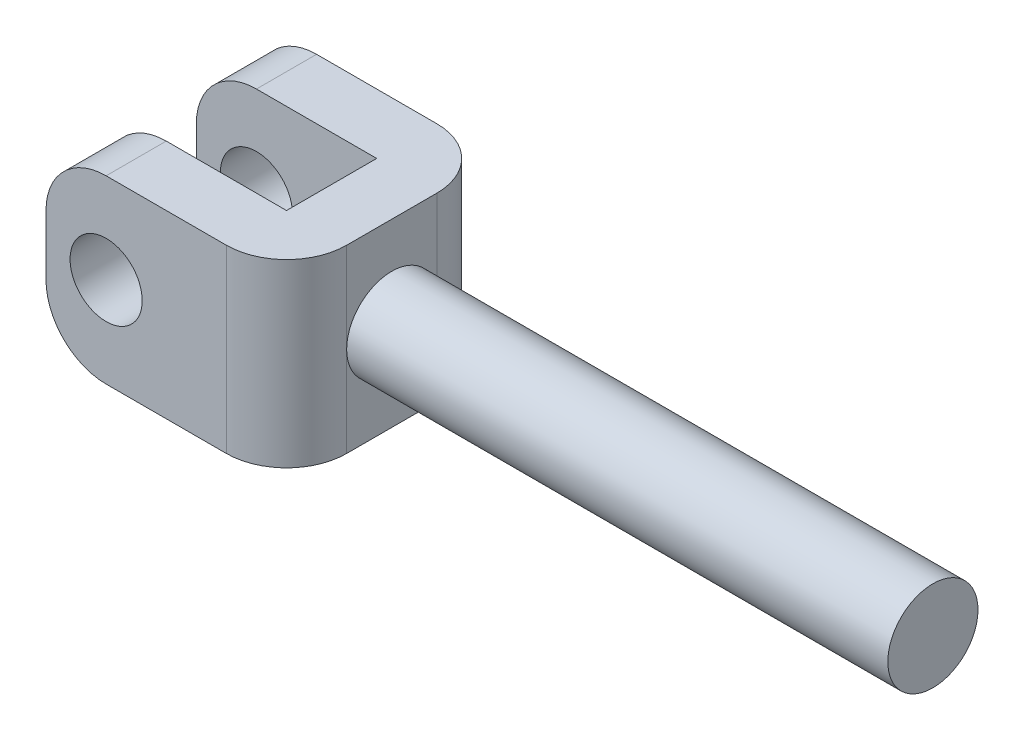
ISO-10303-21;
HEADER;
FILE_DESCRIPTION(('STEP AP214'),'2;1');
FILE_NAME('part.step','',(''),(''),'','','');
FILE_SCHEMA(('AUTOMOTIVE_DESIGN { 1 0 10303 214 1 1 1 1 }'));
ENDSEC;
DATA;
#1=APPLICATION_CONTEXT('core data for automotive mechanical design processes');
#2=APPLICATION_PROTOCOL_DEFINITION('international standard','automotive_design',2000,#1);
#3=PRODUCT_CONTEXT('',#1,'mechanical');
#4=PRODUCT('Part','Part','',(#3));
#5=PRODUCT_RELATED_PRODUCT_CATEGORY('part','',(#4));
#6=PRODUCT_DEFINITION_FORMATION('','',#4);
#7=PRODUCT_DEFINITION_CONTEXT('part definition',#1,'design');
#8=PRODUCT_DEFINITION('design','',#6,#7);
#9=PRODUCT_DEFINITION_SHAPE('','',#8);
#10=(LENGTH_UNIT() NAMED_UNIT(*) SI_UNIT(.MILLI.,.METRE.));
#11=(NAMED_UNIT(*) PLANE_ANGLE_UNIT() SI_UNIT($,.RADIAN.));
#12=(NAMED_UNIT(*) SI_UNIT($,.STERADIAN.) SOLID_ANGLE_UNIT());
#13=UNCERTAINTY_MEASURE_WITH_UNIT(LENGTH_MEASURE(1.E-05),#10,'distance_accuracy_value','');
#14=(GEOMETRIC_REPRESENTATION_CONTEXT(3) GLOBAL_UNCERTAINTY_ASSIGNED_CONTEXT((#13)) GLOBAL_UNIT_ASSIGNED_CONTEXT((#10,
#11,#12)) REPRESENTATION_CONTEXT('',''));
#15=CARTESIAN_POINT('',(0.,0.,0.));
#16=DIRECTION('',(0.,0.,1.));
#17=DIRECTION('',(1.,0.,0.));
#18=AXIS2_PLACEMENT_3D('',#15,#16,#17);
#19=CARTESIAN_POINT('',(1.,-1.5,-1.75));
#20=DIRECTION('',(1.,0.,0.));
#21=DIRECTION('',(0.,0.,-1.));
#22=AXIS2_PLACEMENT_3D('',#19,#20,#21);
#23=PLANE('',#22);
#24=DIRECTION('',(0.,0.,-1.));
#25=VECTOR('',#24,1.);
#26=CARTESIAN_POINT('',(1.,-1.5,-1.75));
#27=LINE('',#26,#25);
#28=CARTESIAN_POINT('',(1.,-1.5,0.75));
#29=VERTEX_POINT('',#28);
#30=CARTESIAN_POINT('',(1.,-1.5,-0.75));
#31=VERTEX_POINT('',#30);
#32=EDGE_CURVE('E210',#29,#31,#27,.T.);
#33=ORIENTED_EDGE('',*,*,#32,.T.);
#34=DIRECTION('',(0.,1.,0.));
#35=VECTOR('',#34,1.);
#36=CARTESIAN_POINT('',(1.,-1.5,-0.75));
#37=LINE('',#36,#35);
#38=CARTESIAN_POINT('',(0.999999999999999,0.,-0.75));
#39=VERTEX_POINT('',#38);
#40=EDGE_CURVE('E11',#31,#39,#37,.T.);
#41=ORIENTED_EDGE('',*,*,#40,.T.);
#42=CARTESIAN_POINT('',(0.999999999999999,0.,0.));
#43=DIRECTION('',(1.,0.,0.));
#44=DIRECTION('',(0.,0.,-1.));
#45=AXIS2_PLACEMENT_3D('',#42,#43,#44);
#46=CIRCLE('',#45,0.75);
#47=CARTESIAN_POINT('',(0.999999999999999,0.,0.75));
#48=VERTEX_POINT('',#47);
#49=EDGE_CURVE('E221',#48,#39,#46,.T.);
#50=ORIENTED_EDGE('',*,*,#49,.F.);
#51=DIRECTION('',(0.,1.,0.));
#52=VECTOR('',#51,1.);
#53=CARTESIAN_POINT('',(1.,-1.5,0.75));
#54=LINE('',#53,#52);
#55=EDGE_CURVE('E313',#48,#29,#54,.F.);
#56=ORIENTED_EDGE('',*,*,#55,.T.);
#57=EDGE_LOOP('',(#33,#41,#50,#56));
#58=FACE_BOUND('',#57,.T.);
#59=ADVANCED_FACE('F41',(#58),#23,.T.);
#60=CARTESIAN_POINT('',(10.,0.,0.));
#61=DIRECTION('',(-1.,0.,0.));
#62=DIRECTION('',(0.,0.,1.));
#63=AXIS2_PLACEMENT_3D('',#60,#61,#62);
#64=CYLINDRICAL_SURFACE('',#63,0.75);
#65=EDGE_CURVE('E241',#39,#48,#46,.T.);
#66=ORIENTED_EDGE('',*,*,#65,.T.);
#67=ORIENTED_EDGE('',*,*,#49,.T.);
#68=EDGE_LOOP('',(#66,#67));
#69=FACE_BOUND('',#68,.T.);
#70=CARTESIAN_POINT('',(10.,0.,0.));
#71=DIRECTION('',(1.,0.,0.));
#72=DIRECTION('',(0.,0.,-1.));
#73=AXIS2_PLACEMENT_3D('',#70,#71,#72);
#74=CIRCLE('',#73,0.75);
#75=CARTESIAN_POINT('',(10.,0.,-0.75));
#76=VERTEX_POINT('',#75);
#77=EDGE_CURVE('E236',#76,#76,#74,.T.);
#78=ORIENTED_EDGE('',*,*,#77,.F.);
#79=EDGE_LOOP('',(#78));
#80=FACE_BOUND('',#79,.T.);
#81=ADVANCED_FACE('F354',(#69,#80),#64,.T.);
#82=CARTESIAN_POINT('',(10.,0.,0.));
#83=DIRECTION('',(1.,0.,0.));
#84=DIRECTION('',(0.,0.,-1.));
#85=AXIS2_PLACEMENT_3D('',#82,#83,#84);
#86=PLANE('',#85);
#87=ORIENTED_EDGE('',*,*,#77,.T.);
#88=EDGE_LOOP('',(#87));
#89=FACE_BOUND('',#88,.T.);
#90=ADVANCED_FACE('F360',(#89),#86,.T.);
#91=CARTESIAN_POINT('',(0.,-1.5,-0.75));
#92=DIRECTION('',(0.,0.,1.));
#93=DIRECTION('',(1.,0.,0.));
#94=AXIS2_PLACEMENT_3D('',#91,#92,#93);
#95=PLANE('',#94);
#96=CARTESIAN_POINT('',(-2.,0.,-0.75));
#97=DIRECTION('',(0.,0.,1.));
#98=DIRECTION('',(1.,0.,0.));
#99=AXIS2_PLACEMENT_3D('',#96,#97,#98);
#100=CIRCLE('',#99,0.6);
#101=CARTESIAN_POINT('',(-1.4,0.,-0.75));
#102=VERTEX_POINT('',#101);
#103=EDGE_CURVE('E164',#102,#102,#100,.T.);
#104=ORIENTED_EDGE('',*,*,#103,.F.);
#105=EDGE_LOOP('',(#104));
#106=FACE_BOUND('',#105,.T.);
#107=DIRECTION('',(1.,0.,0.));
#108=VECTOR('',#107,1.);
#109=CARTESIAN_POINT('',(0.,1.5,-0.75));
#110=LINE('',#109,#108);
#111=CARTESIAN_POINT('',(-2.,1.5,-0.75));
#112=VERTEX_POINT('',#111);
#113=CARTESIAN_POINT('',(0.,1.5,-0.75));
#114=VERTEX_POINT('',#113);
#115=EDGE_CURVE('E152',#112,#114,#110,.T.);
#116=ORIENTED_EDGE('',*,*,#115,.F.);
#117=CARTESIAN_POINT('',(-2.,0.5,-0.75));
#118=DIRECTION('',(0.,0.,1.));
#119=DIRECTION('',(1.,0.,0.));
#120=AXIS2_PLACEMENT_3D('',#117,#118,#119);
#121=CIRCLE('',#120,1.);
#122=CARTESIAN_POINT('',(-3.,0.5,-0.75));
#123=VERTEX_POINT('',#122);
#124=EDGE_CURVE('E259',#112,#123,#121,.T.);
#125=ORIENTED_EDGE('',*,*,#124,.T.);
#126=DIRECTION('',(0.,1.,0.));
#127=VECTOR('',#126,1.);
#128=CARTESIAN_POINT('',(-3.,-1.5,-0.75));
#129=LINE('',#128,#127);
#130=CARTESIAN_POINT('',(-3.,-0.5,-0.75));
#131=VERTEX_POINT('',#130);
#132=EDGE_CURVE('E217',#131,#123,#129,.T.);
#133=ORIENTED_EDGE('',*,*,#132,.F.);
#134=CARTESIAN_POINT('',(-2.,-0.5,-0.75));
#135=DIRECTION('',(0.,0.,1.));
#136=DIRECTION('',(1.,0.,0.));
#137=AXIS2_PLACEMENT_3D('',#134,#135,#136);
#138=CIRCLE('',#137,1.);
#139=CARTESIAN_POINT('',(-2.,-1.5,-0.75));
#140=VERTEX_POINT('',#139);
#141=EDGE_CURVE('E256',#131,#140,#138,.T.);
#142=ORIENTED_EDGE('',*,*,#141,.T.);
#143=DIRECTION('',(1.,0.,0.));
#144=VECTOR('',#143,1.);
#145=CARTESIAN_POINT('',(0.,-1.5,-0.75));
#146=LINE('',#145,#144);
#147=CARTESIAN_POINT('',(0.,-1.5,-0.75));
#148=VERTEX_POINT('',#147);
#149=EDGE_CURVE('E170',#140,#148,#146,.T.);
#150=ORIENTED_EDGE('',*,*,#149,.T.);
#151=DIRECTION('',(0.,1.,0.));
#152=VECTOR('',#151,1.);
#153=CARTESIAN_POINT('',(0.,-1.5,-0.75));
#154=LINE('',#153,#152);
#155=EDGE_CURVE('E167',#148,#114,#154,.T.);
#156=ORIENTED_EDGE('',*,*,#155,.T.);
#157=EDGE_LOOP('',(#116,#125,#133,#142,#150,#156));
#158=FACE_BOUND('',#157,.T.);
#159=ADVANCED_FACE('F168',(#106,#158),#95,.T.);
#160=CARTESIAN_POINT('',(-3.,-1.5,-1.75));
#161=DIRECTION('',(-1.,0.,0.));
#162=DIRECTION('',(0.,0.,1.));
#163=AXIS2_PLACEMENT_3D('',#160,#161,#162);
#164=PLANE('',#163);
#165=ORIENTED_EDGE('',*,*,#132,.T.);
#166=DIRECTION('',(0.,0.,1.));
#167=VECTOR('',#166,1.);
#168=CARTESIAN_POINT('',(-3.,0.5,-1.75));
#169=LINE('',#168,#167);
#170=CARTESIAN_POINT('',(-3.,0.5,-1.75));
#171=VERTEX_POINT('',#170);
#172=EDGE_CURVE('E266',#123,#171,#169,.F.);
#173=ORIENTED_EDGE('',*,*,#172,.T.);
#174=DIRECTION('',(0.,1.,0.));
#175=VECTOR('',#174,1.);
#176=CARTESIAN_POINT('',(-3.,-1.5,-1.75));
#177=LINE('',#176,#175);
#178=CARTESIAN_POINT('',(-3.,-0.5,-1.75));
#179=VERTEX_POINT('',#178);
#180=EDGE_CURVE('E222',#179,#171,#177,.T.);
#181=ORIENTED_EDGE('',*,*,#180,.F.);
#182=DIRECTION('',(0.,0.,1.));
#183=VECTOR('',#182,1.);
#184=CARTESIAN_POINT('',(-3.,-0.5,-0.75));
#185=LINE('',#184,#183);
#186=EDGE_CURVE('E262',#179,#131,#185,.T.);
#187=ORIENTED_EDGE('',*,*,#186,.T.);
#188=EDGE_LOOP('',(#165,#173,#181,#187));
#189=FACE_BOUND('',#188,.T.);
#190=ADVANCED_FACE('F338',(#189),#164,.T.);
#191=CARTESIAN_POINT('',(1.,-1.5,-1.75));
#192=DIRECTION('',(0.,0.,-1.));
#193=DIRECTION('',(-1.,0.,0.));
#194=AXIS2_PLACEMENT_3D('',#191,#192,#193);
#195=PLANE('',#194);
#196=CARTESIAN_POINT('',(-2.,0.,-1.75));
#197=DIRECTION('',(0.,0.,-1.));
#198=DIRECTION('',(-1.,0.,0.));
#199=AXIS2_PLACEMENT_3D('',#196,#197,#198);
#200=CIRCLE('',#199,0.6);
#201=CARTESIAN_POINT('',(-2.6,0.,-1.75));
#202=VERTEX_POINT('',#201);
#203=EDGE_CURVE('E402',#202,#202,#200,.T.);
#204=ORIENTED_EDGE('',*,*,#203,.F.);
#205=EDGE_LOOP('',(#204));
#206=FACE_BOUND('',#205,.T.);
#207=ORIENTED_EDGE('',*,*,#180,.T.);
#208=CARTESIAN_POINT('',(-2.,0.5,-1.75));
#209=DIRECTION('',(0.,0.,-1.));
#210=DIRECTION('',(-1.,0.,0.));
#211=AXIS2_PLACEMENT_3D('',#208,#209,#210);
#212=CIRCLE('',#211,1.);
#213=CARTESIAN_POINT('',(-2.,1.5,-1.75));
#214=VERTEX_POINT('',#213);
#215=EDGE_CURVE('E275',#171,#214,#212,.T.);
#216=ORIENTED_EDGE('',*,*,#215,.T.);
#217=DIRECTION('',(-1.,0.,0.));
#218=VECTOR('',#217,1.);
#219=CARTESIAN_POINT('',(1.,1.5,-1.75));
#220=LINE('',#219,#218);
#221=CARTESIAN_POINT('',(0.,1.5,-1.75));
#222=VERTEX_POINT('',#221);
#223=EDGE_CURVE('E194',#222,#214,#220,.T.);
#224=ORIENTED_EDGE('',*,*,#223,.F.);
#225=DIRECTION('',(0.,1.,0.));
#226=VECTOR('',#225,1.);
#227=CARTESIAN_POINT('',(0.,-1.5,-1.75));
#228=LINE('',#227,#226);
#229=CARTESIAN_POINT('',(0.,-1.5,-1.75));
#230=VERTEX_POINT('',#229);
#231=EDGE_CURVE('E269',#222,#230,#228,.F.);
#232=ORIENTED_EDGE('',*,*,#231,.T.);
#233=DIRECTION('',(-1.,0.,0.));
#234=VECTOR('',#233,1.);
#235=CARTESIAN_POINT('',(1.,-1.5,-1.75));
#236=LINE('',#235,#234);
#237=CARTESIAN_POINT('',(-2.,-1.5,-1.75));
#238=VERTEX_POINT('',#237);
#239=EDGE_CURVE('E176',#230,#238,#236,.T.);
#240=ORIENTED_EDGE('',*,*,#239,.T.);
#241=CARTESIAN_POINT('',(-2.,-0.5,-1.75));
#242=DIRECTION('',(0.,0.,-1.));
#243=DIRECTION('',(-1.,0.,0.));
#244=AXIS2_PLACEMENT_3D('',#241,#242,#243);
#245=CIRCLE('',#244,1.);
#246=EDGE_CURVE('E272',#238,#179,#245,.T.);
#247=ORIENTED_EDGE('',*,*,#246,.T.);
#248=EDGE_LOOP('',(#207,#216,#224,#232,#240,#247));
#249=FACE_BOUND('',#248,.T.);
#250=ADVANCED_FACE('F326',(#206,#249),#195,.T.);
#251=ORIENTED_EDGE('',*,*,#65,.F.);
#252=DIRECTION('',(0.,1.,0.));
#253=VECTOR('',#252,1.);
#254=CARTESIAN_POINT('',(1.,-1.5,-0.75));
#255=LINE('',#254,#253);
#256=CARTESIAN_POINT('',(1.,1.5,-0.75));
#257=VERTEX_POINT('',#256);
#258=EDGE_CURVE('E51',#39,#257,#255,.T.);
#259=ORIENTED_EDGE('',*,*,#258,.T.);
#260=DIRECTION('',(0.,0.,-1.));
#261=VECTOR('',#260,1.);
#262=CARTESIAN_POINT('',(1.,1.5,-1.75));
#263=LINE('',#262,#261);
#264=CARTESIAN_POINT('',(1.,1.5,0.75));
#265=VERTEX_POINT('',#264);
#266=EDGE_CURVE('E190',#265,#257,#263,.T.);
#267=ORIENTED_EDGE('',*,*,#266,.F.);
#268=DIRECTION('',(0.,1.,0.));
#269=VECTOR('',#268,1.);
#270=CARTESIAN_POINT('',(1.,-1.5,0.75));
#271=LINE('',#270,#269);
#272=EDGE_CURVE('E58',#265,#48,#271,.F.);
#273=ORIENTED_EDGE('',*,*,#272,.T.);
#274=EDGE_LOOP('',(#251,#259,#267,#273));
#275=FACE_BOUND('',#274,.T.);
#276=ADVANCED_FACE('F319',(#275),#23,.T.);
#277=CARTESIAN_POINT('',(1.,-1.5,1.75));
#278=DIRECTION('',(0.,0.,1.));
#279=DIRECTION('',(1.,0.,0.));
#280=AXIS2_PLACEMENT_3D('',#277,#278,#279);
#281=PLANE('',#280);
#282=CARTESIAN_POINT('',(-2.,0.,1.75));
#283=DIRECTION('',(0.,0.,1.));
#284=DIRECTION('',(1.,0.,0.));
#285=AXIS2_PLACEMENT_3D('',#282,#283,#284);
#286=CIRCLE('',#285,0.6);
#287=CARTESIAN_POINT('',(-1.4,0.,1.75));
#288=VERTEX_POINT('',#287);
#289=EDGE_CURVE('E397',#288,#288,#286,.T.);
#290=ORIENTED_EDGE('',*,*,#289,.F.);
#291=EDGE_LOOP('',(#290));
#292=FACE_BOUND('',#291,.T.);
#293=DIRECTION('',(0.,1.,0.));
#294=VECTOR('',#293,1.);
#295=CARTESIAN_POINT('',(-3.,-1.5,1.75));
#296=LINE('',#295,#294);
#297=CARTESIAN_POINT('',(-3.,-0.5,1.75));
#298=VERTEX_POINT('',#297);
#299=CARTESIAN_POINT('',(-3.,0.5,1.75));
#300=VERTEX_POINT('',#299);
#301=EDGE_CURVE('E226',#298,#300,#296,.T.);
#302=ORIENTED_EDGE('',*,*,#301,.F.);
#303=CARTESIAN_POINT('',(-2.,-0.5,1.75));
#304=DIRECTION('',(0.,0.,1.));
#305=DIRECTION('',(1.,0.,0.));
#306=AXIS2_PLACEMENT_3D('',#303,#304,#305);
#307=CIRCLE('',#306,1.);
#308=CARTESIAN_POINT('',(-2.,-1.5,1.75));
#309=VERTEX_POINT('',#308);
#310=EDGE_CURVE('E304',#298,#309,#307,.T.);
#311=ORIENTED_EDGE('',*,*,#310,.T.);
#312=DIRECTION('',(1.,0.,0.));
#313=VECTOR('',#312,1.);
#314=CARTESIAN_POINT('',(1.,-1.5,1.75));
#315=LINE('',#314,#313);
#316=CARTESIAN_POINT('',(0.,-1.5,1.75));
#317=VERTEX_POINT('',#316);
#318=EDGE_CURVE('E206',#309,#317,#315,.T.);
#319=ORIENTED_EDGE('',*,*,#318,.T.);
#320=DIRECTION('',(0.,1.,0.));
#321=VECTOR('',#320,1.);
#322=CARTESIAN_POINT('',(0.,-1.5,1.75));
#323=LINE('',#322,#321);
#324=CARTESIAN_POINT('',(0.,1.5,1.75));
#325=VERTEX_POINT('',#324);
#326=EDGE_CURVE('E297',#317,#325,#323,.T.);
#327=ORIENTED_EDGE('',*,*,#326,.T.);
#328=DIRECTION('',(1.,0.,0.));
#329=VECTOR('',#328,1.);
#330=CARTESIAN_POINT('',(1.,1.5,1.75));
#331=LINE('',#330,#329);
#332=CARTESIAN_POINT('',(-2.,1.5,1.75));
#333=VERTEX_POINT('',#332);
#334=EDGE_CURVE('E183',#333,#325,#331,.T.);
#335=ORIENTED_EDGE('',*,*,#334,.F.);
#336=CARTESIAN_POINT('',(-2.,0.5,1.75));
#337=DIRECTION('',(0.,0.,1.));
#338=DIRECTION('',(1.,0.,0.));
#339=AXIS2_PLACEMENT_3D('',#336,#337,#338);
#340=CIRCLE('',#339,1.);
#341=EDGE_CURVE('E301',#333,#300,#340,.T.);
#342=ORIENTED_EDGE('',*,*,#341,.T.);
#343=EDGE_LOOP('',(#302,#311,#319,#327,#335,#342));
#344=FACE_BOUND('',#343,.T.);
#345=ADVANCED_FACE('F365',(#292,#344),#281,.T.);
#346=CARTESIAN_POINT('',(-3.,-1.5,0.75));
#347=DIRECTION('',(-1.,0.,0.));
#348=DIRECTION('',(0.,0.,1.));
#349=AXIS2_PLACEMENT_3D('',#346,#347,#348);
#350=PLANE('',#349);
#351=DIRECTION('',(0.,1.,0.));
#352=VECTOR('',#351,1.);
#353=CARTESIAN_POINT('',(-3.,-1.5,0.75));
#354=LINE('',#353,#352);
#355=CARTESIAN_POINT('',(-3.,-0.5,0.75));
#356=VERTEX_POINT('',#355);
#357=CARTESIAN_POINT('',(-3.,0.5,0.75));
#358=VERTEX_POINT('',#357);
#359=EDGE_CURVE('E230',#356,#358,#354,.T.);
#360=ORIENTED_EDGE('',*,*,#359,.F.);
#361=DIRECTION('',(0.,0.,1.));
#362=VECTOR('',#361,1.);
#363=CARTESIAN_POINT('',(-3.,-0.5,1.75));
#364=LINE('',#363,#362);
#365=EDGE_CURVE('E293',#356,#298,#364,.T.);
#366=ORIENTED_EDGE('',*,*,#365,.T.);
#367=ORIENTED_EDGE('',*,*,#301,.T.);
#368=DIRECTION('',(0.,0.,1.));
#369=VECTOR('',#368,1.);
#370=CARTESIAN_POINT('',(-3.,0.5,0.75));
#371=LINE('',#370,#369);
#372=EDGE_CURVE('E290',#300,#358,#371,.F.);
#373=ORIENTED_EDGE('',*,*,#372,.T.);
#374=EDGE_LOOP('',(#360,#366,#367,#373));
#375=FACE_BOUND('',#374,.T.);
#376=ADVANCED_FACE('F370',(#375),#350,.T.);
#377=CARTESIAN_POINT('',(-3.,-1.5,0.75));
#378=DIRECTION('',(0.,0.,-1.));
#379=DIRECTION('',(-1.,0.,0.));
#380=AXIS2_PLACEMENT_3D('',#377,#378,#379);
#381=PLANE('',#380);
#382=CARTESIAN_POINT('',(-2.,0.,0.75));
#383=DIRECTION('',(0.,0.,-1.));
#384=DIRECTION('',(-1.,0.,0.));
#385=AXIS2_PLACEMENT_3D('',#382,#383,#384);
#386=CIRCLE('',#385,0.6);
#387=CARTESIAN_POINT('',(-2.6,0.,0.75));
#388=VERTEX_POINT('',#387);
#389=EDGE_CURVE('E45',#388,#388,#386,.T.);
#390=ORIENTED_EDGE('',*,*,#389,.F.);
#391=EDGE_LOOP('',(#390));
#392=FACE_BOUND('',#391,.T.);
#393=DIRECTION('',(-1.,0.,0.));
#394=VECTOR('',#393,1.);
#395=CARTESIAN_POINT('',(-3.,-1.5,0.75));
#396=LINE('',#395,#394);
#397=CARTESIAN_POINT('',(0.,-1.5,0.75));
#398=VERTEX_POINT('',#397);
#399=CARTESIAN_POINT('',(-2.,-1.5,0.75));
#400=VERTEX_POINT('',#399);
#401=EDGE_CURVE('E202',#398,#400,#396,.T.);
#402=ORIENTED_EDGE('',*,*,#401,.T.);
#403=CARTESIAN_POINT('',(-2.,-0.5,0.75));
#404=DIRECTION('',(0.,0.,-1.));
#405=DIRECTION('',(-1.,0.,0.));
#406=AXIS2_PLACEMENT_3D('',#403,#404,#405);
#407=CIRCLE('',#406,1.);
#408=EDGE_CURVE('E310',#400,#356,#407,.T.);
#409=ORIENTED_EDGE('',*,*,#408,.T.);
#410=ORIENTED_EDGE('',*,*,#359,.T.);
#411=CARTESIAN_POINT('',(-2.,0.5,0.75));
#412=DIRECTION('',(0.,0.,-1.));
#413=DIRECTION('',(-1.,0.,0.));
#414=AXIS2_PLACEMENT_3D('',#411,#412,#413);
#415=CIRCLE('',#414,1.);
#416=CARTESIAN_POINT('',(-2.,1.5,0.75));
#417=VERTEX_POINT('',#416);
#418=EDGE_CURVE('E307',#358,#417,#415,.T.);
#419=ORIENTED_EDGE('',*,*,#418,.T.);
#420=DIRECTION('',(-1.,0.,0.));
#421=VECTOR('',#420,1.);
#422=CARTESIAN_POINT('',(-3.,1.5,0.75));
#423=LINE('',#422,#421);
#424=CARTESIAN_POINT('',(0.,1.5,0.75));
#425=VERTEX_POINT('',#424);
#426=EDGE_CURVE('E180',#425,#417,#423,.T.);
#427=ORIENTED_EDGE('',*,*,#426,.F.);
#428=DIRECTION('',(0.,1.,0.));
#429=VECTOR('',#428,1.);
#430=CARTESIAN_POINT('',(0.,-1.5,0.75));
#431=LINE('',#430,#429);
#432=EDGE_CURVE('E175',#398,#425,#431,.T.);
#433=ORIENTED_EDGE('',*,*,#432,.F.);
#434=EDGE_LOOP('',(#402,#409,#410,#419,#427,#433));
#435=FACE_BOUND('',#434,.T.);
#436=ADVANCED_FACE('F381',(#392,#435),#381,.T.);
#437=CARTESIAN_POINT('',(0.,-1.5,0.));
#438=DIRECTION('',(0.,1.,0.));
#439=DIRECTION('',(0.,0.,1.));
#440=AXIS2_PLACEMENT_3D('',#437,#438,#439);
#441=PLANE('',#440);
#442=ORIENTED_EDGE('',*,*,#149,.F.);
#443=DIRECTION('',(0.,0.,1.));
#444=VECTOR('',#443,1.);
#445=CARTESIAN_POINT('',(-2.,-1.5,-1.75));
#446=LINE('',#445,#444);
#447=EDGE_CURVE('E287',#140,#238,#446,.F.);
#448=ORIENTED_EDGE('',*,*,#447,.T.);
#449=ORIENTED_EDGE('',*,*,#239,.F.);
#450=CARTESIAN_POINT('',(0.,-1.5,-0.75));
#451=DIRECTION('',(0.,1.,0.));
#452=DIRECTION('',(0.,0.,1.));
#453=AXIS2_PLACEMENT_3D('',#450,#451,#452);
#454=CIRCLE('',#453,1.);
#455=EDGE_CURVE('E281',#230,#31,#454,.F.);
#456=ORIENTED_EDGE('',*,*,#455,.T.);
#457=ORIENTED_EDGE('',*,*,#32,.F.);
#458=CARTESIAN_POINT('',(0.,-1.5,0.75));
#459=DIRECTION('',(0.,1.,0.));
#460=DIRECTION('',(0.,0.,1.));
#461=AXIS2_PLACEMENT_3D('',#458,#459,#460);
#462=CIRCLE('',#461,1.);
#463=EDGE_CURVE('E278',#29,#317,#462,.F.);
#464=ORIENTED_EDGE('',*,*,#463,.T.);
#465=ORIENTED_EDGE('',*,*,#318,.F.);
#466=DIRECTION('',(0.,0.,1.));
#467=VECTOR('',#466,1.);
#468=CARTESIAN_POINT('',(-2.,-1.5,0.75));
#469=LINE('',#468,#467);
#470=EDGE_CURVE('E284',#309,#400,#469,.F.);
#471=ORIENTED_EDGE('',*,*,#470,.T.);
#472=ORIENTED_EDGE('',*,*,#401,.F.);
#473=DIRECTION('',(0.,0.,1.));
#474=VECTOR('',#473,1.);
#475=CARTESIAN_POINT('',(0.,-1.5,-0.75));
#476=LINE('',#475,#474);
#477=EDGE_CURVE('E199',#148,#398,#476,.T.);
#478=ORIENTED_EDGE('',*,*,#477,.F.);
#479=EDGE_LOOP('',(#442,#448,#449,#456,#457,#464,#465,#471,#472,#478));
#480=FACE_BOUND('',#479,.T.);
#481=ADVANCED_FACE('F329',(#480),#441,.F.);
#482=CARTESIAN_POINT('',(0.,1.5,0.));
#483=DIRECTION('',(0.,1.,0.));
#484=DIRECTION('',(0.,0.,1.));
#485=AXIS2_PLACEMENT_3D('',#482,#483,#484);
#486=PLANE('',#485);
#487=ORIENTED_EDGE('',*,*,#223,.T.);
#488=DIRECTION('',(0.,0.,1.));
#489=VECTOR('',#488,1.);
#490=CARTESIAN_POINT('',(-2.,1.5,0.));
#491=LINE('',#490,#489);
#492=EDGE_CURVE('E161',#214,#112,#491,.T.);
#493=ORIENTED_EDGE('',*,*,#492,.T.);
#494=ORIENTED_EDGE('',*,*,#115,.T.);
#495=DIRECTION('',(0.,0.,1.));
#496=VECTOR('',#495,1.);
#497=CARTESIAN_POINT('',(0.,1.5,-0.75));
#498=LINE('',#497,#496);
#499=EDGE_CURVE('E158',#114,#425,#498,.T.);
#500=ORIENTED_EDGE('',*,*,#499,.T.);
#501=ORIENTED_EDGE('',*,*,#426,.T.);
#502=DIRECTION('',(0.,0.,1.));
#503=VECTOR('',#502,1.);
#504=CARTESIAN_POINT('',(-2.,1.5,0.));
#505=LINE('',#504,#503);
#506=EDGE_CURVE('E250',#417,#333,#505,.T.);
#507=ORIENTED_EDGE('',*,*,#506,.T.);
#508=ORIENTED_EDGE('',*,*,#334,.T.);
#509=CARTESIAN_POINT('',(0.,1.5,0.75));
#510=DIRECTION('',(0.,1.,0.));
#511=DIRECTION('',(0.,0.,1.));
#512=AXIS2_PLACEMENT_3D('',#509,#510,#511);
#513=CIRCLE('',#512,1.);
#514=EDGE_CURVE('E240',#325,#265,#513,.T.);
#515=ORIENTED_EDGE('',*,*,#514,.T.);
#516=ORIENTED_EDGE('',*,*,#266,.T.);
#517=CARTESIAN_POINT('',(0.,1.5,-0.75));
#518=DIRECTION('',(0.,1.,0.));
#519=DIRECTION('',(0.,0.,1.));
#520=AXIS2_PLACEMENT_3D('',#517,#518,#519);
#521=CIRCLE('',#520,1.);
#522=EDGE_CURVE('E247',#257,#222,#521,.T.);
#523=ORIENTED_EDGE('',*,*,#522,.T.);
#524=EDGE_LOOP('',(#487,#493,#494,#500,#501,#507,#508,#515,#516,#523));
#525=FACE_BOUND('',#524,.T.);
#526=ADVANCED_FACE('F155',(#525),#486,.T.);
#527=CARTESIAN_POINT('',(0.,0.,0.));
#528=DIRECTION('',(1.,0.,0.));
#529=DIRECTION('',(0.,0.,-1.));
#530=AXIS2_PLACEMENT_3D('',#527,#528,#529);
#531=PLANE('',#530);
#532=ORIENTED_EDGE('',*,*,#477,.T.);
#533=ORIENTED_EDGE('',*,*,#432,.T.);
#534=ORIENTED_EDGE('',*,*,#499,.F.);
#535=ORIENTED_EDGE('',*,*,#155,.F.);
#536=EDGE_LOOP('',(#532,#533,#534,#535));
#537=FACE_BOUND('',#536,.T.);
#538=ADVANCED_FACE('F178',(#537),#531,.F.);
#539=CARTESIAN_POINT('',(-2.,0.5,0.));
#540=DIRECTION('',(0.,0.,1.));
#541=DIRECTION('',(1.,0.,0.));
#542=AXIS2_PLACEMENT_3D('',#539,#540,#541);
#543=CYLINDRICAL_SURFACE('',#542,1.);
#544=ORIENTED_EDGE('',*,*,#215,.F.);
#545=ORIENTED_EDGE('',*,*,#172,.F.);
#546=ORIENTED_EDGE('',*,*,#124,.F.);
#547=ORIENTED_EDGE('',*,*,#492,.F.);
#548=EDGE_LOOP('',(#544,#545,#546,#547));
#549=FACE_BOUND('',#548,.T.);
#550=ADVANCED_FACE('F342',(#549),#543,.T.);
#551=CARTESIAN_POINT('',(-2.,-0.5,-1.75));
#552=DIRECTION('',(0.,0.,-1.));
#553=DIRECTION('',(-1.,0.,0.));
#554=AXIS2_PLACEMENT_3D('',#551,#552,#553);
#555=CYLINDRICAL_SURFACE('',#554,1.);
#556=ORIENTED_EDGE('',*,*,#246,.F.);
#557=ORIENTED_EDGE('',*,*,#447,.F.);
#558=ORIENTED_EDGE('',*,*,#141,.F.);
#559=ORIENTED_EDGE('',*,*,#186,.F.);
#560=EDGE_LOOP('',(#556,#557,#558,#559));
#561=FACE_BOUND('',#560,.T.);
#562=ADVANCED_FACE('F333',(#561),#555,.T.);
#563=CARTESIAN_POINT('',(-2.,-0.5,0.75));
#564=DIRECTION('',(0.,0.,-1.));
#565=DIRECTION('',(-1.,0.,0.));
#566=AXIS2_PLACEMENT_3D('',#563,#564,#565);
#567=CYLINDRICAL_SURFACE('',#566,1.);
#568=ORIENTED_EDGE('',*,*,#408,.F.);
#569=ORIENTED_EDGE('',*,*,#470,.F.);
#570=ORIENTED_EDGE('',*,*,#310,.F.);
#571=ORIENTED_EDGE('',*,*,#365,.F.);
#572=EDGE_LOOP('',(#568,#569,#570,#571));
#573=FACE_BOUND('',#572,.T.);
#574=ADVANCED_FACE('F349',(#573),#567,.T.);
#575=CARTESIAN_POINT('',(-2.,0.5,0.));
#576=DIRECTION('',(0.,0.,1.));
#577=DIRECTION('',(1.,0.,0.));
#578=AXIS2_PLACEMENT_3D('',#575,#576,#577);
#579=CYLINDRICAL_SURFACE('',#578,1.);
#580=ORIENTED_EDGE('',*,*,#418,.F.);
#581=ORIENTED_EDGE('',*,*,#372,.F.);
#582=ORIENTED_EDGE('',*,*,#341,.F.);
#583=ORIENTED_EDGE('',*,*,#506,.F.);
#584=EDGE_LOOP('',(#580,#581,#582,#583));
#585=FACE_BOUND('',#584,.T.);
#586=ADVANCED_FACE('F445',(#585),#579,.T.);
#587=CARTESIAN_POINT('',(0.,-1.5,-0.75));
#588=DIRECTION('',(0.,1.,0.));
#589=DIRECTION('',(0.,0.,1.));
#590=AXIS2_PLACEMENT_3D('',#587,#588,#589);
#591=CYLINDRICAL_SURFACE('',#590,1.);
#592=ORIENTED_EDGE('',*,*,#455,.F.);
#593=ORIENTED_EDGE('',*,*,#231,.F.);
#594=ORIENTED_EDGE('',*,*,#522,.F.);
#595=ORIENTED_EDGE('',*,*,#258,.F.);
#596=ORIENTED_EDGE('',*,*,#40,.F.);
#597=EDGE_LOOP('',(#592,#593,#594,#595,#596));
#598=FACE_BOUND('',#597,.T.);
#599=ADVANCED_FACE('F323',(#598),#591,.T.);
#600=CARTESIAN_POINT('',(0.,-1.5,0.75));
#601=DIRECTION('',(0.,1.,0.));
#602=DIRECTION('',(0.,0.,1.));
#603=AXIS2_PLACEMENT_3D('',#600,#601,#602);
#604=CYLINDRICAL_SURFACE('',#603,1.);
#605=ORIENTED_EDGE('',*,*,#55,.F.);
#606=ORIENTED_EDGE('',*,*,#272,.F.);
#607=ORIENTED_EDGE('',*,*,#514,.F.);
#608=ORIENTED_EDGE('',*,*,#326,.F.);
#609=ORIENTED_EDGE('',*,*,#463,.F.);
#610=EDGE_LOOP('',(#605,#606,#607,#608,#609));
#611=FACE_BOUND('',#610,.T.);
#612=ADVANCED_FACE('F43',(#611),#604,.T.);
#613=CARTESIAN_POINT('',(-2.,0.,3.25));
#614=DIRECTION('',(0.,0.,-1.));
#615=DIRECTION('',(-1.,0.,0.));
#616=AXIS2_PLACEMENT_3D('',#613,#614,#615);
#617=CYLINDRICAL_SURFACE('',#616,0.6);
#618=ORIENTED_EDGE('',*,*,#289,.T.);
#619=EDGE_LOOP('',(#618));
#620=FACE_BOUND('',#619,.T.);
#621=ORIENTED_EDGE('',*,*,#389,.T.);
#622=EDGE_LOOP('',(#621));
#623=FACE_BOUND('',#622,.T.);
#624=ADVANCED_FACE('F384',(#620,#623),#617,.F.);
#625=ORIENTED_EDGE('',*,*,#103,.T.);
#626=EDGE_LOOP('',(#625));
#627=FACE_BOUND('',#626,.T.);
#628=ORIENTED_EDGE('',*,*,#203,.T.);
#629=EDGE_LOOP('',(#628));
#630=FACE_BOUND('',#629,.T.);
#631=ADVANCED_FACE('F386',(#627,#630),#617,.F.);
#632=CLOSED_SHELL('',(#59,#81,#90,#159,#190,#250,#276,#345,#376,#436,#481,#526,#538,#550,#562,
#574,#586,#599,#612,#624,#631));
#633=MANIFOLD_SOLID_BREP('B2',#632);
#634=ADVANCED_BREP_SHAPE_REPRESENTATION('',(#18,#633),#14);
#635=SHAPE_DEFINITION_REPRESENTATION(#9,#634);
ENDSEC;
END-ISO-10303-21;
